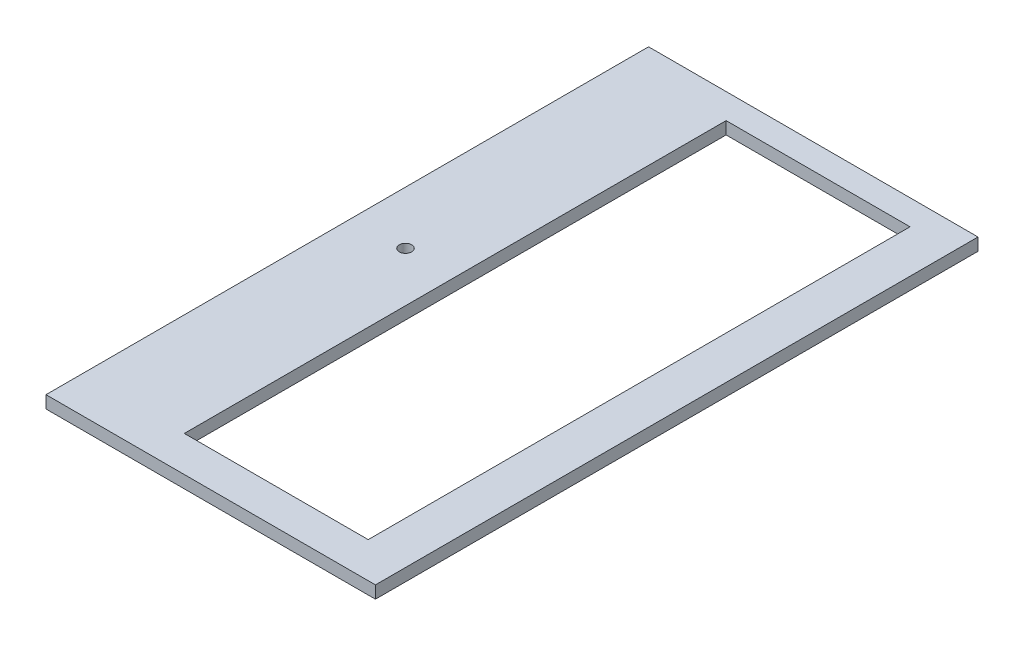
ISO-10303-21;
HEADER;
FILE_DESCRIPTION(('STEP AP214'),'2;1');
FILE_NAME('part.step','',(''),(''),'','','');
FILE_SCHEMA(('AUTOMOTIVE_DESIGN { 1 0 10303 214 1 1 1 1 }'));
ENDSEC;
DATA;
#1=APPLICATION_CONTEXT('core data for automotive mechanical design processes');
#2=APPLICATION_PROTOCOL_DEFINITION('international standard','automotive_design',2000,#1);
#3=PRODUCT_CONTEXT('',#1,'mechanical');
#4=PRODUCT('Part','Part','',(#3));
#5=PRODUCT_RELATED_PRODUCT_CATEGORY('part','',(#4));
#6=PRODUCT_DEFINITION_FORMATION('','',#4);
#7=PRODUCT_DEFINITION_CONTEXT('part definition',#1,'design');
#8=PRODUCT_DEFINITION('design','',#6,#7);
#9=PRODUCT_DEFINITION_SHAPE('','',#8);
#10=(LENGTH_UNIT() NAMED_UNIT(*) SI_UNIT(.MILLI.,.METRE.));
#11=(NAMED_UNIT(*) PLANE_ANGLE_UNIT() SI_UNIT($,.RADIAN.));
#12=(NAMED_UNIT(*) SI_UNIT($,.STERADIAN.) SOLID_ANGLE_UNIT());
#13=UNCERTAINTY_MEASURE_WITH_UNIT(LENGTH_MEASURE(1.E-05),#10,'distance_accuracy_value','');
#14=(GEOMETRIC_REPRESENTATION_CONTEXT(3) GLOBAL_UNCERTAINTY_ASSIGNED_CONTEXT((#13)) GLOBAL_UNIT_ASSIGNED_CONTEXT((#10,
#11,#12)) REPRESENTATION_CONTEXT('',''));
#15=CARTESIAN_POINT('',(0.,0.,0.));
#16=DIRECTION('',(0.,0.,1.));
#17=DIRECTION('',(1.,0.,0.));
#18=AXIS2_PLACEMENT_3D('',#15,#16,#17);
#19=CARTESIAN_POINT('',(-80.,-3.175,0.));
#20=DIRECTION('',(0.,1.,0.));
#21=DIRECTION('',(0.,0.,1.));
#22=AXIS2_PLACEMENT_3D('',#19,#20,#21);
#23=PLANE('',#22);
#24=CARTESIAN_POINT('',(-50.1661434686448,-3.175,0.));
#25=DIRECTION('',(0.,1.,0.));
#26=DIRECTION('',(0.,0.,1.));
#27=AXIS2_PLACEMENT_3D('',#24,#25,#26);
#28=CIRCLE('',#27,1.5875);
#29=CARTESIAN_POINT('',(-50.1661434686448,-3.175,1.5875));
#30=VERTEX_POINT('',#29);
#31=EDGE_CURVE('E131',#30,#30,#28,.T.);
#32=ORIENTED_EDGE('',*,*,#31,.T.);
#33=EDGE_LOOP('',(#32));
#34=FACE_BOUND('',#33,.T.);
#35=DIRECTION('',(-1.,0.,0.));
#36=VECTOR('',#35,1.);
#37=CARTESIAN_POINT('',(-37.4661434686448,-3.175,-69.215));
#38=LINE('',#37,#36);
#39=CARTESIAN_POINT('',(9.52385653135523,-3.175,-69.215));
#40=VERTEX_POINT('',#39);
#41=CARTESIAN_POINT('',(-37.4661434686448,-3.175,-69.215));
#42=VERTEX_POINT('',#41);
#43=EDGE_CURVE('E145',#40,#42,#38,.T.);
#44=ORIENTED_EDGE('',*,*,#43,.T.);
#45=DIRECTION('',(0.,0.,1.));
#46=VECTOR('',#45,1.);
#47=CARTESIAN_POINT('',(-37.4661434686448,-3.175,-69.215));
#48=LINE('',#47,#46);
#49=CARTESIAN_POINT('',(-37.4661434686448,-3.175,69.215));
#50=VERTEX_POINT('',#49);
#51=EDGE_CURVE('E137',#42,#50,#48,.T.);
#52=ORIENTED_EDGE('',*,*,#51,.T.);
#53=DIRECTION('',(1.,0.,0.));
#54=VECTOR('',#53,1.);
#55=CARTESIAN_POINT('',(-37.4661434686448,-3.175,69.215));
#56=LINE('',#55,#54);
#57=CARTESIAN_POINT('',(9.52385653135522,-3.175,69.215));
#58=VERTEX_POINT('',#57);
#59=EDGE_CURVE('E140',#50,#58,#56,.T.);
#60=ORIENTED_EDGE('',*,*,#59,.T.);
#61=DIRECTION('',(0.,0.,-1.));
#62=VECTOR('',#61,1.);
#63=CARTESIAN_POINT('',(9.52385653135523,-3.175,-69.215));
#64=LINE('',#63,#62);
#65=EDGE_CURVE('E56',#58,#40,#64,.T.);
#66=ORIENTED_EDGE('',*,*,#65,.T.);
#67=EDGE_LOOP('',(#44,#52,#60,#66));
#68=FACE_BOUND('',#67,.T.);
#69=DIRECTION('',(0.,0.,-1.));
#70=VECTOR('',#69,1.);
#71=CARTESIAN_POINT('',(-63.7086592278625,-3.175,-75.6443999025907));
#72=LINE('',#71,#70);
#73=CARTESIAN_POINT('',(-63.7086592278625,-3.175,78.3079351104284));
#74=VERTEX_POINT('',#73);
#75=CARTESIAN_POINT('',(-63.7086592278625,-3.175,-75.6443999025907));
#76=VERTEX_POINT('',#75);
#77=EDGE_CURVE('E108',#74,#76,#72,.T.);
#78=ORIENTED_EDGE('',*,*,#77,.T.);
#79=DIRECTION('',(1.,0.,0.));
#80=VECTOR('',#79,1.);
#81=CARTESIAN_POINT('',(24.7207096723492,-3.175,-75.6443999025907));
#82=LINE('',#81,#80);
#83=CARTESIAN_POINT('',(20.4590533398089,-3.175,-75.6443999025907));
#84=VERTEX_POINT('',#83);
#85=EDGE_CURVE('E105',#76,#84,#82,.T.);
#86=ORIENTED_EDGE('',*,*,#85,.T.);
#87=DIRECTION('',(0.,0.,1.));
#88=VECTOR('',#87,1.);
#89=CARTESIAN_POINT('',(20.4590533398089,-3.175,-78.840642151996));
#90=LINE('',#89,#88);
#91=CARTESIAN_POINT('',(20.4590533398089,-3.175,78.3079351104284));
#92=VERTEX_POINT('',#91);
#93=EDGE_CURVE('E116',#84,#92,#90,.T.);
#94=ORIENTED_EDGE('',*,*,#93,.T.);
#95=DIRECTION('',(-1.,0.,0.));
#96=VECTOR('',#95,1.);
#97=CARTESIAN_POINT('',(-63.7086592278625,-3.175,78.3079351104284));
#98=LINE('',#97,#96);
#99=EDGE_CURVE('E48',#92,#74,#98,.T.);
#100=ORIENTED_EDGE('',*,*,#99,.T.);
#101=EDGE_LOOP('',(#78,#86,#94,#100));
#102=FACE_BOUND('',#101,.T.);
#103=ADVANCED_FACE('F33',(#34,#68,#102),#23,.F.);
#104=CARTESIAN_POINT('',(-80.,0.,0.));
#105=DIRECTION('',(0.,1.,0.));
#106=DIRECTION('',(0.,0.,1.));
#107=AXIS2_PLACEMENT_3D('',#104,#105,#106);
#108=PLANE('',#107);
#109=DIRECTION('',(1.,0.,0.));
#110=VECTOR('',#109,1.);
#111=CARTESIAN_POINT('',(24.7207096723492,0.,-75.6443999025907));
#112=LINE('',#111,#110);
#113=CARTESIAN_POINT('',(-63.7086592278625,0.,-75.6443999025907));
#114=VERTEX_POINT('',#113);
#115=CARTESIAN_POINT('',(20.4590533398089,0.,-75.6443999025907));
#116=VERTEX_POINT('',#115);
#117=EDGE_CURVE('E117',#114,#116,#112,.T.);
#118=ORIENTED_EDGE('',*,*,#117,.F.);
#119=DIRECTION('',(0.,0.,-1.));
#120=VECTOR('',#119,1.);
#121=CARTESIAN_POINT('',(-63.7086592278625,0.,-75.6443999025907));
#122=LINE('',#121,#120);
#123=CARTESIAN_POINT('',(-63.7086592278625,0.,78.3079351104284));
#124=VERTEX_POINT('',#123);
#125=EDGE_CURVE('E119',#124,#114,#122,.T.);
#126=ORIENTED_EDGE('',*,*,#125,.F.);
#127=DIRECTION('',(-1.,0.,0.));
#128=VECTOR('',#127,1.);
#129=CARTESIAN_POINT('',(-63.7086592278625,0.,78.3079351104284));
#130=LINE('',#129,#128);
#131=CARTESIAN_POINT('',(20.4590533398089,0.,78.3079351104284));
#132=VERTEX_POINT('',#131);
#133=EDGE_CURVE('E100',#132,#124,#130,.T.);
#134=ORIENTED_EDGE('',*,*,#133,.F.);
#135=DIRECTION('',(0.,0.,1.));
#136=VECTOR('',#135,1.);
#137=CARTESIAN_POINT('',(20.4590533398089,0.,-78.840642151996));
#138=LINE('',#137,#136);
#139=EDGE_CURVE('E125',#116,#132,#138,.T.);
#140=ORIENTED_EDGE('',*,*,#139,.F.);
#141=EDGE_LOOP('',(#118,#126,#134,#140));
#142=FACE_BOUND('',#141,.T.);
#143=CARTESIAN_POINT('',(-50.1661434686448,0.,0.));
#144=DIRECTION('',(0.,1.,0.));
#145=DIRECTION('',(0.,0.,1.));
#146=AXIS2_PLACEMENT_3D('',#143,#144,#145);
#147=CIRCLE('',#146,1.5875);
#148=CARTESIAN_POINT('',(-50.1661434686448,0.,1.5875));
#149=VERTEX_POINT('',#148);
#150=EDGE_CURVE('E128',#149,#149,#147,.T.);
#151=ORIENTED_EDGE('',*,*,#150,.F.);
#152=EDGE_LOOP('',(#151));
#153=FACE_BOUND('',#152,.T.);
#154=DIRECTION('',(0.,0.,1.));
#155=VECTOR('',#154,1.);
#156=CARTESIAN_POINT('',(-37.4661434686448,0.,-69.215));
#157=LINE('',#156,#155);
#158=CARTESIAN_POINT('',(-37.4661434686448,0.,-69.215));
#159=VERTEX_POINT('',#158);
#160=CARTESIAN_POINT('',(-37.4661434686448,0.,69.215));
#161=VERTEX_POINT('',#160);
#162=EDGE_CURVE('E134',#159,#161,#157,.T.);
#163=ORIENTED_EDGE('',*,*,#162,.F.);
#164=DIRECTION('',(-1.,0.,0.));
#165=VECTOR('',#164,1.);
#166=CARTESIAN_POINT('',(-37.4661434686448,0.,-69.215));
#167=LINE('',#166,#165);
#168=CARTESIAN_POINT('',(9.52385653135523,0.,-69.215));
#169=VERTEX_POINT('',#168);
#170=EDGE_CURVE('E141',#169,#159,#167,.T.);
#171=ORIENTED_EDGE('',*,*,#170,.F.);
#172=DIRECTION('',(0.,0.,-1.));
#173=VECTOR('',#172,1.);
#174=CARTESIAN_POINT('',(9.52385653135523,0.,-69.215));
#175=LINE('',#174,#173);
#176=CARTESIAN_POINT('',(9.52385653135523,0.,69.215));
#177=VERTEX_POINT('',#176);
#178=EDGE_CURVE('E153',#177,#169,#175,.T.);
#179=ORIENTED_EDGE('',*,*,#178,.F.);
#180=DIRECTION('',(1.,0.,0.));
#181=VECTOR('',#180,1.);
#182=CARTESIAN_POINT('',(-37.4661434686448,0.,69.215));
#183=LINE('',#182,#181);
#184=EDGE_CURVE('E150',#161,#177,#183,.T.);
#185=ORIENTED_EDGE('',*,*,#184,.F.);
#186=EDGE_LOOP('',(#163,#171,#179,#185));
#187=FACE_BOUND('',#186,.T.);
#188=ADVANCED_FACE('F35',(#142,#153,#187),#108,.T.);
#189=CARTESIAN_POINT('',(-37.4661434686448,-3.175,-69.215));
#190=DIRECTION('',(-1.,0.,0.));
#191=DIRECTION('',(0.,0.,1.));
#192=AXIS2_PLACEMENT_3D('',#189,#190,#191);
#193=PLANE('',#192);
#194=ORIENTED_EDGE('',*,*,#162,.T.);
#195=DIRECTION('',(0.,1.,0.));
#196=VECTOR('',#195,1.);
#197=CARTESIAN_POINT('',(-37.4661434686448,-3.175,69.215));
#198=LINE('',#197,#196);
#199=EDGE_CURVE('E148',#50,#161,#198,.T.);
#200=ORIENTED_EDGE('',*,*,#199,.F.);
#201=ORIENTED_EDGE('',*,*,#51,.F.);
#202=DIRECTION('',(0.,1.,0.));
#203=VECTOR('',#202,1.);
#204=CARTESIAN_POINT('',(-37.4661434686448,-3.175,-69.215));
#205=LINE('',#204,#203);
#206=EDGE_CURVE('E158',#42,#159,#205,.T.);
#207=ORIENTED_EDGE('',*,*,#206,.T.);
#208=EDGE_LOOP('',(#194,#200,#201,#207));
#209=FACE_BOUND('',#208,.T.);
#210=ADVANCED_FACE('F190',(#209),#193,.F.);
#211=CARTESIAN_POINT('',(-37.4661434686448,-3.175,-69.215));
#212=DIRECTION('',(0.,0.,-1.));
#213=DIRECTION('',(-1.,0.,0.));
#214=AXIS2_PLACEMENT_3D('',#211,#212,#213);
#215=PLANE('',#214);
#216=ORIENTED_EDGE('',*,*,#170,.T.);
#217=ORIENTED_EDGE('',*,*,#206,.F.);
#218=ORIENTED_EDGE('',*,*,#43,.F.);
#219=DIRECTION('',(0.,1.,0.));
#220=VECTOR('',#219,1.);
#221=CARTESIAN_POINT('',(9.52385653135523,-3.175,-69.215));
#222=LINE('',#221,#220);
#223=EDGE_CURVE('E160',#40,#169,#222,.T.);
#224=ORIENTED_EDGE('',*,*,#223,.T.);
#225=EDGE_LOOP('',(#216,#217,#218,#224));
#226=FACE_BOUND('',#225,.T.);
#227=ADVANCED_FACE('F195',(#226),#215,.F.);
#228=CARTESIAN_POINT('',(9.52385653135523,-3.175,-69.215));
#229=DIRECTION('',(1.,0.,0.));
#230=DIRECTION('',(0.,0.,-1.));
#231=AXIS2_PLACEMENT_3D('',#228,#229,#230);
#232=PLANE('',#231);
#233=ORIENTED_EDGE('',*,*,#178,.T.);
#234=ORIENTED_EDGE('',*,*,#223,.F.);
#235=ORIENTED_EDGE('',*,*,#65,.F.);
#236=DIRECTION('',(0.,1.,0.));
#237=VECTOR('',#236,1.);
#238=CARTESIAN_POINT('',(9.52385653135523,-3.175,69.215));
#239=LINE('',#238,#237);
#240=EDGE_CURVE('E162',#58,#177,#239,.T.);
#241=ORIENTED_EDGE('',*,*,#240,.T.);
#242=EDGE_LOOP('',(#233,#234,#235,#241));
#243=FACE_BOUND('',#242,.T.);
#244=ADVANCED_FACE('F200',(#243),#232,.F.);
#245=CARTESIAN_POINT('',(-37.4661434686448,-3.175,69.215));
#246=DIRECTION('',(0.,0.,1.));
#247=DIRECTION('',(1.,0.,0.));
#248=AXIS2_PLACEMENT_3D('',#245,#246,#247);
#249=PLANE('',#248);
#250=ORIENTED_EDGE('',*,*,#184,.T.);
#251=ORIENTED_EDGE('',*,*,#240,.F.);
#252=ORIENTED_EDGE('',*,*,#59,.F.);
#253=ORIENTED_EDGE('',*,*,#199,.T.);
#254=EDGE_LOOP('',(#250,#251,#252,#253));
#255=FACE_BOUND('',#254,.T.);
#256=ADVANCED_FACE('F197',(#255),#249,.F.);
#257=CARTESIAN_POINT('',(-50.1661434686448,-3.175,0.));
#258=DIRECTION('',(0.,1.,0.));
#259=DIRECTION('',(0.,0.,1.));
#260=AXIS2_PLACEMENT_3D('',#257,#258,#259);
#261=CYLINDRICAL_SURFACE('',#260,1.5875);
#262=ORIENTED_EDGE('',*,*,#31,.F.);
#263=EDGE_LOOP('',(#262));
#264=FACE_BOUND('',#263,.T.);
#265=ORIENTED_EDGE('',*,*,#150,.T.);
#266=EDGE_LOOP('',(#265));
#267=FACE_BOUND('',#266,.T.);
#268=ADVANCED_FACE('F181',(#264,#267),#261,.F.);
#269=CARTESIAN_POINT('',(20.4590533398089,-3.175,-78.840642151996));
#270=DIRECTION('',(-1.,0.,0.));
#271=DIRECTION('',(0.,0.,1.));
#272=AXIS2_PLACEMENT_3D('',#269,#270,#271);
#273=PLANE('',#272);
#274=ORIENTED_EDGE('',*,*,#93,.F.);
#275=DIRECTION('',(0.,1.,0.));
#276=VECTOR('',#275,1.);
#277=CARTESIAN_POINT('',(20.4590533398089,-3.175,-75.6443999025907));
#278=LINE('',#277,#276);
#279=EDGE_CURVE('E11',#84,#116,#278,.T.);
#280=ORIENTED_EDGE('',*,*,#279,.T.);
#281=ORIENTED_EDGE('',*,*,#139,.T.);
#282=DIRECTION('',(0.,-1.,0.));
#283=VECTOR('',#282,1.);
#284=CARTESIAN_POINT('',(20.4590533398089,-3.175,78.3079351104284));
#285=LINE('',#284,#283);
#286=EDGE_CURVE('E41',#132,#92,#285,.T.);
#287=ORIENTED_EDGE('',*,*,#286,.T.);
#288=EDGE_LOOP('',(#274,#280,#281,#287));
#289=FACE_BOUND('',#288,.T.);
#290=ADVANCED_FACE('F166',(#289),#273,.F.);
#291=CARTESIAN_POINT('',(24.7207096723492,-3.175,-75.6443999025907));
#292=DIRECTION('',(0.,0.,1.));
#293=DIRECTION('',(1.,0.,0.));
#294=AXIS2_PLACEMENT_3D('',#291,#292,#293);
#295=PLANE('',#294);
#296=ORIENTED_EDGE('',*,*,#85,.F.);
#297=DIRECTION('',(0.,1.,0.));
#298=VECTOR('',#297,1.);
#299=CARTESIAN_POINT('',(-63.7086592278625,-3.175,-75.6443999025907));
#300=LINE('',#299,#298);
#301=EDGE_CURVE('E104',#76,#114,#300,.T.);
#302=ORIENTED_EDGE('',*,*,#301,.T.);
#303=ORIENTED_EDGE('',*,*,#117,.T.);
#304=ORIENTED_EDGE('',*,*,#279,.F.);
#305=EDGE_LOOP('',(#296,#302,#303,#304));
#306=FACE_BOUND('',#305,.T.);
#307=ADVANCED_FACE('F172',(#306),#295,.F.);
#308=CARTESIAN_POINT('',(-63.7086592278625,-3.175,78.3079351104284));
#309=DIRECTION('',(0.,0.,-1.));
#310=DIRECTION('',(-1.,0.,0.));
#311=AXIS2_PLACEMENT_3D('',#308,#309,#310);
#312=PLANE('',#311);
#313=ORIENTED_EDGE('',*,*,#133,.T.);
#314=DIRECTION('',(0.,1.,0.));
#315=VECTOR('',#314,1.);
#316=CARTESIAN_POINT('',(-63.7086592278625,-3.175,78.3079351104284));
#317=LINE('',#316,#315);
#318=EDGE_CURVE('E96',#74,#124,#317,.T.);
#319=ORIENTED_EDGE('',*,*,#318,.F.);
#320=ORIENTED_EDGE('',*,*,#99,.F.);
#321=ORIENTED_EDGE('',*,*,#286,.F.);
#322=EDGE_LOOP('',(#313,#319,#320,#321));
#323=FACE_BOUND('',#322,.T.);
#324=ADVANCED_FACE('F98',(#323),#312,.F.);
#325=CARTESIAN_POINT('',(-63.7086592278625,-3.175,-75.6443999025907));
#326=DIRECTION('',(1.,0.,0.));
#327=DIRECTION('',(0.,0.,-1.));
#328=AXIS2_PLACEMENT_3D('',#325,#326,#327);
#329=PLANE('',#328);
#330=ORIENTED_EDGE('',*,*,#125,.T.);
#331=ORIENTED_EDGE('',*,*,#301,.F.);
#332=ORIENTED_EDGE('',*,*,#77,.F.);
#333=ORIENTED_EDGE('',*,*,#318,.T.);
#334=EDGE_LOOP('',(#330,#331,#332,#333));
#335=FACE_BOUND('',#334,.T.);
#336=ADVANCED_FACE('F109',(#335),#329,.F.);
#337=CLOSED_SHELL('',(#103,#188,#210,#227,#244,#256,#268,#290,#307,#324,#336));
#338=MANIFOLD_SOLID_BREP('B2',#337);
#339=ADVANCED_BREP_SHAPE_REPRESENTATION('',(#18,#338),#14);
#340=SHAPE_DEFINITION_REPRESENTATION(#9,#339);
ENDSEC;
END-ISO-10303-21;
